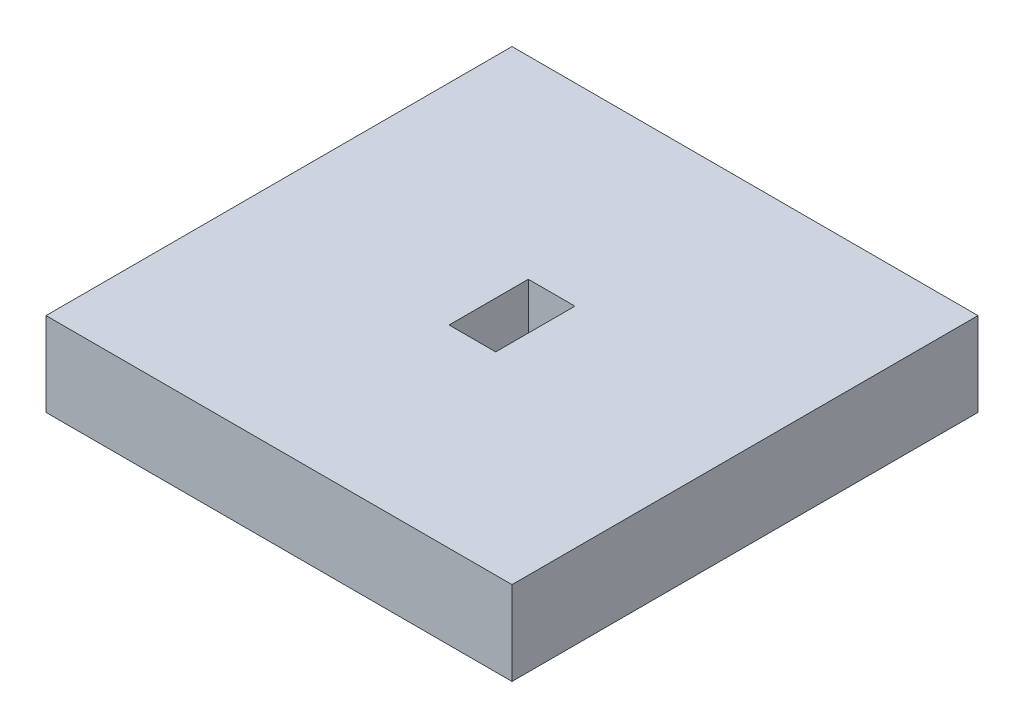
ISO-10303-21;
HEADER;
FILE_DESCRIPTION(('STEP AP214'),'2;1');
FILE_NAME('part.step','',(''),(''),'','','');
FILE_SCHEMA(('AUTOMOTIVE_DESIGN { 1 0 10303 214 1 1 1 1 }'));
ENDSEC;
DATA;
#1=APPLICATION_CONTEXT('core data for automotive mechanical design processes');
#2=APPLICATION_PROTOCOL_DEFINITION('international standard','automotive_design',2000,#1);
#3=PRODUCT_CONTEXT('',#1,'mechanical');
#4=PRODUCT('Part','Part','',(#3));
#5=PRODUCT_RELATED_PRODUCT_CATEGORY('part','',(#4));
#6=PRODUCT_DEFINITION_FORMATION('','',#4);
#7=PRODUCT_DEFINITION_CONTEXT('part definition',#1,'design');
#8=PRODUCT_DEFINITION('design','',#6,#7);
#9=PRODUCT_DEFINITION_SHAPE('','',#8);
#10=(LENGTH_UNIT() NAMED_UNIT(*) SI_UNIT(.MILLI.,.METRE.));
#11=(NAMED_UNIT(*) PLANE_ANGLE_UNIT() SI_UNIT($,.RADIAN.));
#12=(NAMED_UNIT(*) SI_UNIT($,.STERADIAN.) SOLID_ANGLE_UNIT());
#13=UNCERTAINTY_MEASURE_WITH_UNIT(LENGTH_MEASURE(1.E-05),#10,'distance_accuracy_value','');
#14=(GEOMETRIC_REPRESENTATION_CONTEXT(3) GLOBAL_UNCERTAINTY_ASSIGNED_CONTEXT((#13)) GLOBAL_UNIT_ASSIGNED_CONTEXT((#10,
#11,#12)) REPRESENTATION_CONTEXT('',''));
#15=CARTESIAN_POINT('',(0.,0.,0.));
#16=DIRECTION('',(0.,0.,1.));
#17=DIRECTION('',(1.,0.,0.));
#18=AXIS2_PLACEMENT_3D('',#15,#16,#17);
#19=CARTESIAN_POINT('',(-50.,18.,50.));
#20=DIRECTION('',(1.,0.,0.));
#21=DIRECTION('',(0.,0.,-1.));
#22=AXIS2_PLACEMENT_3D('',#19,#20,#21);
#23=PLANE('',#22);
#24=DIRECTION('',(0.,0.,1.));
#25=VECTOR('',#24,1.);
#26=CARTESIAN_POINT('',(-50.,0.,50.));
#27=LINE('',#26,#25);
#28=CARTESIAN_POINT('',(-50.,0.,-50.));
#29=VERTEX_POINT('',#28);
#30=CARTESIAN_POINT('',(-50.,0.,50.));
#31=VERTEX_POINT('',#30);
#32=EDGE_CURVE('E135',#29,#31,#27,.T.);
#33=ORIENTED_EDGE('',*,*,#32,.T.);
#34=DIRECTION('',(0.,-1.,0.));
#35=VECTOR('',#34,1.);
#36=CARTESIAN_POINT('',(-50.,18.,50.));
#37=LINE('',#36,#35);
#38=CARTESIAN_POINT('',(-50.,18.,50.));
#39=VERTEX_POINT('',#38);
#40=EDGE_CURVE('E11',#39,#31,#37,.T.);
#41=ORIENTED_EDGE('',*,*,#40,.F.);
#42=DIRECTION('',(0.,0.,1.));
#43=VECTOR('',#42,1.);
#44=CARTESIAN_POINT('',(-50.,18.,50.));
#45=LINE('',#44,#43);
#46=CARTESIAN_POINT('',(-50.,18.,-50.));
#47=VERTEX_POINT('',#46);
#48=EDGE_CURVE('E136',#47,#39,#45,.T.);
#49=ORIENTED_EDGE('',*,*,#48,.F.);
#50=DIRECTION('',(0.,-1.,0.));
#51=VECTOR('',#50,1.);
#52=CARTESIAN_POINT('',(-50.,18.,-50.));
#53=LINE('',#52,#51);
#54=EDGE_CURVE('E146',#47,#29,#53,.T.);
#55=ORIENTED_EDGE('',*,*,#54,.T.);
#56=EDGE_LOOP('',(#33,#41,#49,#55));
#57=FACE_BOUND('',#56,.T.);
#58=ADVANCED_FACE('F35',(#57),#23,.F.);
#59=CARTESIAN_POINT('',(50.,18.,50.));
#60=DIRECTION('',(0.,0.,-1.));
#61=DIRECTION('',(-1.,0.,0.));
#62=AXIS2_PLACEMENT_3D('',#59,#60,#61);
#63=PLANE('',#62);
#64=DIRECTION('',(1.,0.,0.));
#65=VECTOR('',#64,1.);
#66=CARTESIAN_POINT('',(50.,0.,50.));
#67=LINE('',#66,#65);
#68=CARTESIAN_POINT('',(50.,0.,50.));
#69=VERTEX_POINT('',#68);
#70=EDGE_CURVE('E149',#31,#69,#67,.T.);
#71=ORIENTED_EDGE('',*,*,#70,.T.);
#72=DIRECTION('',(0.,-1.,0.));
#73=VECTOR('',#72,1.);
#74=CARTESIAN_POINT('',(50.,18.,50.));
#75=LINE('',#74,#73);
#76=CARTESIAN_POINT('',(50.,18.,50.));
#77=VERTEX_POINT('',#76);
#78=EDGE_CURVE('E42',#77,#69,#75,.T.);
#79=ORIENTED_EDGE('',*,*,#78,.F.);
#80=DIRECTION('',(1.,0.,0.));
#81=VECTOR('',#80,1.);
#82=CARTESIAN_POINT('',(50.,18.,50.));
#83=LINE('',#82,#81);
#84=EDGE_CURVE('E139',#39,#77,#83,.T.);
#85=ORIENTED_EDGE('',*,*,#84,.F.);
#86=ORIENTED_EDGE('',*,*,#40,.T.);
#87=EDGE_LOOP('',(#71,#79,#85,#86));
#88=FACE_BOUND('',#87,.T.);
#89=ADVANCED_FACE('F177',(#88),#63,.F.);
#90=CARTESIAN_POINT('',(50.,18.,50.));
#91=DIRECTION('',(-1.,0.,0.));
#92=DIRECTION('',(0.,0.,1.));
#93=AXIS2_PLACEMENT_3D('',#90,#91,#92);
#94=PLANE('',#93);
#95=DIRECTION('',(0.,0.,-1.));
#96=VECTOR('',#95,1.);
#97=CARTESIAN_POINT('',(50.,0.,50.));
#98=LINE('',#97,#96);
#99=CARTESIAN_POINT('',(50.,0.,-50.));
#100=VERTEX_POINT('',#99);
#101=EDGE_CURVE('E151',#69,#100,#98,.T.);
#102=ORIENTED_EDGE('',*,*,#101,.T.);
#103=DIRECTION('',(0.,-1.,0.));
#104=VECTOR('',#103,1.);
#105=CARTESIAN_POINT('',(50.,18.,-50.));
#106=LINE('',#105,#104);
#107=CARTESIAN_POINT('',(50.,18.,-50.));
#108=VERTEX_POINT('',#107);
#109=EDGE_CURVE('E156',#108,#100,#106,.T.);
#110=ORIENTED_EDGE('',*,*,#109,.F.);
#111=DIRECTION('',(0.,0.,-1.));
#112=VECTOR('',#111,1.);
#113=CARTESIAN_POINT('',(50.,18.,50.));
#114=LINE('',#113,#112);
#115=EDGE_CURVE('E142',#77,#108,#114,.T.);
#116=ORIENTED_EDGE('',*,*,#115,.F.);
#117=ORIENTED_EDGE('',*,*,#78,.T.);
#118=EDGE_LOOP('',(#102,#110,#116,#117));
#119=FACE_BOUND('',#118,.T.);
#120=ADVANCED_FACE('F163',(#119),#94,.F.);
#121=CARTESIAN_POINT('',(50.,18.,-50.));
#122=DIRECTION('',(0.,0.,1.));
#123=DIRECTION('',(1.,0.,0.));
#124=AXIS2_PLACEMENT_3D('',#121,#122,#123);
#125=PLANE('',#124);
#126=DIRECTION('',(-1.,0.,0.));
#127=VECTOR('',#126,1.);
#128=CARTESIAN_POINT('',(50.,0.,-50.));
#129=LINE('',#128,#127);
#130=EDGE_CURVE('E140',#100,#29,#129,.T.);
#131=ORIENTED_EDGE('',*,*,#130,.T.);
#132=ORIENTED_EDGE('',*,*,#54,.F.);
#133=DIRECTION('',(-1.,0.,0.));
#134=VECTOR('',#133,1.);
#135=CARTESIAN_POINT('',(50.,18.,-50.));
#136=LINE('',#135,#134);
#137=EDGE_CURVE('E144',#108,#47,#136,.T.);
#138=ORIENTED_EDGE('',*,*,#137,.F.);
#139=ORIENTED_EDGE('',*,*,#109,.T.);
#140=EDGE_LOOP('',(#131,#132,#138,#139));
#141=FACE_BOUND('',#140,.T.);
#142=ADVANCED_FACE('F170',(#141),#125,.F.);
#143=CARTESIAN_POINT('',(0.,18.,0.));
#144=DIRECTION('',(0.,1.,0.));
#145=DIRECTION('',(0.,0.,1.));
#146=AXIS2_PLACEMENT_3D('',#143,#144,#145);
#147=PLANE('',#146);
#148=DIRECTION('',(0.,0.,1.));
#149=VECTOR('',#148,1.);
#150=CARTESIAN_POINT('',(-5.,18.,0.));
#151=LINE('',#150,#149);
#152=CARTESIAN_POINT('',(-5.,18.,-8.5));
#153=VERTEX_POINT('',#152);
#154=CARTESIAN_POINT('',(-5.,18.,8.5));
#155=VERTEX_POINT('',#154);
#156=EDGE_CURVE('E105',#153,#155,#151,.T.);
#157=ORIENTED_EDGE('',*,*,#156,.F.);
#158=DIRECTION('',(-1.,0.,0.));
#159=VECTOR('',#158,1.);
#160=CARTESIAN_POINT('',(0.,18.,-8.5));
#161=LINE('',#160,#159);
#162=CARTESIAN_POINT('',(5.,18.,-8.5));
#163=VERTEX_POINT('',#162);
#164=EDGE_CURVE('E132',#163,#153,#161,.T.);
#165=ORIENTED_EDGE('',*,*,#164,.F.);
#166=DIRECTION('',(0.,0.,-1.));
#167=VECTOR('',#166,1.);
#168=CARTESIAN_POINT('',(5.,18.,0.));
#169=LINE('',#168,#167);
#170=CARTESIAN_POINT('',(5.,18.,8.5));
#171=VERTEX_POINT('',#170);
#172=EDGE_CURVE('E130',#171,#163,#169,.T.);
#173=ORIENTED_EDGE('',*,*,#172,.F.);
#174=DIRECTION('',(1.,0.,0.));
#175=VECTOR('',#174,1.);
#176=CARTESIAN_POINT('',(0.,18.,8.5));
#177=LINE('',#176,#175);
#178=EDGE_CURVE('E124',#155,#171,#177,.T.);
#179=ORIENTED_EDGE('',*,*,#178,.F.);
#180=EDGE_LOOP('',(#157,#165,#173,#179));
#181=FACE_BOUND('',#180,.T.);
#182=ORIENTED_EDGE('',*,*,#48,.T.);
#183=ORIENTED_EDGE('',*,*,#84,.T.);
#184=ORIENTED_EDGE('',*,*,#115,.T.);
#185=ORIENTED_EDGE('',*,*,#137,.T.);
#186=EDGE_LOOP('',(#182,#183,#184,#185));
#187=FACE_BOUND('',#186,.T.);
#188=ADVANCED_FACE('F176',(#181,#187),#147,.T.);
#189=CARTESIAN_POINT('',(0.,0.,0.));
#190=DIRECTION('',(0.,1.,0.));
#191=DIRECTION('',(0.,0.,1.));
#192=AXIS2_PLACEMENT_3D('',#189,#190,#191);
#193=PLANE('',#192);
#194=DIRECTION('',(-1.,0.,0.));
#195=VECTOR('',#194,1.);
#196=CARTESIAN_POINT('',(5.,0.,-8.5));
#197=LINE('',#196,#195);
#198=CARTESIAN_POINT('',(5.,0.,-8.5));
#199=VERTEX_POINT('',#198);
#200=CARTESIAN_POINT('',(-5.,0.,-8.5));
#201=VERTEX_POINT('',#200);
#202=EDGE_CURVE('E108',#199,#201,#197,.T.);
#203=ORIENTED_EDGE('',*,*,#202,.T.);
#204=DIRECTION('',(0.,0.,1.));
#205=VECTOR('',#204,1.);
#206=CARTESIAN_POINT('',(-5.,0.,8.5));
#207=LINE('',#206,#205);
#208=CARTESIAN_POINT('',(-5.,0.,8.5));
#209=VERTEX_POINT('',#208);
#210=EDGE_CURVE('E102',#201,#209,#207,.T.);
#211=ORIENTED_EDGE('',*,*,#210,.T.);
#212=DIRECTION('',(1.,0.,0.));
#213=VECTOR('',#212,1.);
#214=CARTESIAN_POINT('',(5.,0.,8.5));
#215=LINE('',#214,#213);
#216=CARTESIAN_POINT('',(5.,0.,8.5));
#217=VERTEX_POINT('',#216);
#218=EDGE_CURVE('E111',#209,#217,#215,.T.);
#219=ORIENTED_EDGE('',*,*,#218,.T.);
#220=DIRECTION('',(0.,0.,-1.));
#221=VECTOR('',#220,1.);
#222=CARTESIAN_POINT('',(5.,0.,8.5));
#223=LINE('',#222,#221);
#224=EDGE_CURVE('E57',#217,#199,#223,.T.);
#225=ORIENTED_EDGE('',*,*,#224,.T.);
#226=EDGE_LOOP('',(#203,#211,#219,#225));
#227=FACE_BOUND('',#226,.T.);
#228=ORIENTED_EDGE('',*,*,#32,.F.);
#229=ORIENTED_EDGE('',*,*,#130,.F.);
#230=ORIENTED_EDGE('',*,*,#101,.F.);
#231=ORIENTED_EDGE('',*,*,#70,.F.);
#232=EDGE_LOOP('',(#228,#229,#230,#231));
#233=FACE_BOUND('',#232,.T.);
#234=ADVANCED_FACE('F115',(#227,#233),#193,.F.);
#235=CARTESIAN_POINT('',(-5.,0.,8.5));
#236=DIRECTION('',(-1.,0.,0.));
#237=DIRECTION('',(0.,0.,1.));
#238=AXIS2_PLACEMENT_3D('',#235,#236,#237);
#239=PLANE('',#238);
#240=ORIENTED_EDGE('',*,*,#156,.T.);
#241=DIRECTION('',(0.,1.,0.));
#242=VECTOR('',#241,1.);
#243=CARTESIAN_POINT('',(-5.,0.,8.5));
#244=LINE('',#243,#242);
#245=EDGE_CURVE('E49',#209,#155,#244,.T.);
#246=ORIENTED_EDGE('',*,*,#245,.F.);
#247=ORIENTED_EDGE('',*,*,#210,.F.);
#248=DIRECTION('',(0.,1.,0.));
#249=VECTOR('',#248,1.);
#250=CARTESIAN_POINT('',(-5.,0.,-8.5));
#251=LINE('',#250,#249);
#252=EDGE_CURVE('E122',#201,#153,#251,.T.);
#253=ORIENTED_EDGE('',*,*,#252,.T.);
#254=EDGE_LOOP('',(#240,#246,#247,#253));
#255=FACE_BOUND('',#254,.T.);
#256=ADVANCED_FACE('F99',(#255),#239,.F.);
#257=CARTESIAN_POINT('',(5.,0.,-8.5));
#258=DIRECTION('',(0.,0.,-1.));
#259=DIRECTION('',(-1.,0.,0.));
#260=AXIS2_PLACEMENT_3D('',#257,#258,#259);
#261=PLANE('',#260);
#262=ORIENTED_EDGE('',*,*,#164,.T.);
#263=ORIENTED_EDGE('',*,*,#252,.F.);
#264=ORIENTED_EDGE('',*,*,#202,.F.);
#265=DIRECTION('',(0.,1.,0.));
#266=VECTOR('',#265,1.);
#267=CARTESIAN_POINT('',(5.,0.,-8.5));
#268=LINE('',#267,#266);
#269=EDGE_CURVE('E125',#199,#163,#268,.T.);
#270=ORIENTED_EDGE('',*,*,#269,.T.);
#271=EDGE_LOOP('',(#262,#263,#264,#270));
#272=FACE_BOUND('',#271,.T.);
#273=ADVANCED_FACE('F194',(#272),#261,.F.);
#274=CARTESIAN_POINT('',(5.,0.,8.5));
#275=DIRECTION('',(1.,0.,0.));
#276=DIRECTION('',(0.,0.,-1.));
#277=AXIS2_PLACEMENT_3D('',#274,#275,#276);
#278=PLANE('',#277);
#279=ORIENTED_EDGE('',*,*,#172,.T.);
#280=ORIENTED_EDGE('',*,*,#269,.F.);
#281=ORIENTED_EDGE('',*,*,#224,.F.);
#282=DIRECTION('',(0.,1.,0.));
#283=VECTOR('',#282,1.);
#284=CARTESIAN_POINT('',(5.,0.,8.5));
#285=LINE('',#284,#283);
#286=EDGE_CURVE('E107',#217,#171,#285,.T.);
#287=ORIENTED_EDGE('',*,*,#286,.T.);
#288=EDGE_LOOP('',(#279,#280,#281,#287));
#289=FACE_BOUND('',#288,.T.);
#290=ADVANCED_FACE('F197',(#289),#278,.F.);
#291=CARTESIAN_POINT('',(5.,0.,8.5));
#292=DIRECTION('',(0.,0.,1.));
#293=DIRECTION('',(1.,0.,0.));
#294=AXIS2_PLACEMENT_3D('',#291,#292,#293);
#295=PLANE('',#294);
#296=ORIENTED_EDGE('',*,*,#178,.T.);
#297=ORIENTED_EDGE('',*,*,#286,.F.);
#298=ORIENTED_EDGE('',*,*,#218,.F.);
#299=ORIENTED_EDGE('',*,*,#245,.T.);
#300=EDGE_LOOP('',(#296,#297,#298,#299));
#301=FACE_BOUND('',#300,.T.);
#302=ADVANCED_FACE('F112',(#301),#295,.F.);
#303=CLOSED_SHELL('',(#58,#89,#120,#142,#188,#234,#256,#273,#290,#302));
#304=MANIFOLD_SOLID_BREP('B2',#303);
#305=ADVANCED_BREP_SHAPE_REPRESENTATION('',(#18,#304),#14);
#306=SHAPE_DEFINITION_REPRESENTATION(#9,#305);
ENDSEC;
END-ISO-10303-21;
